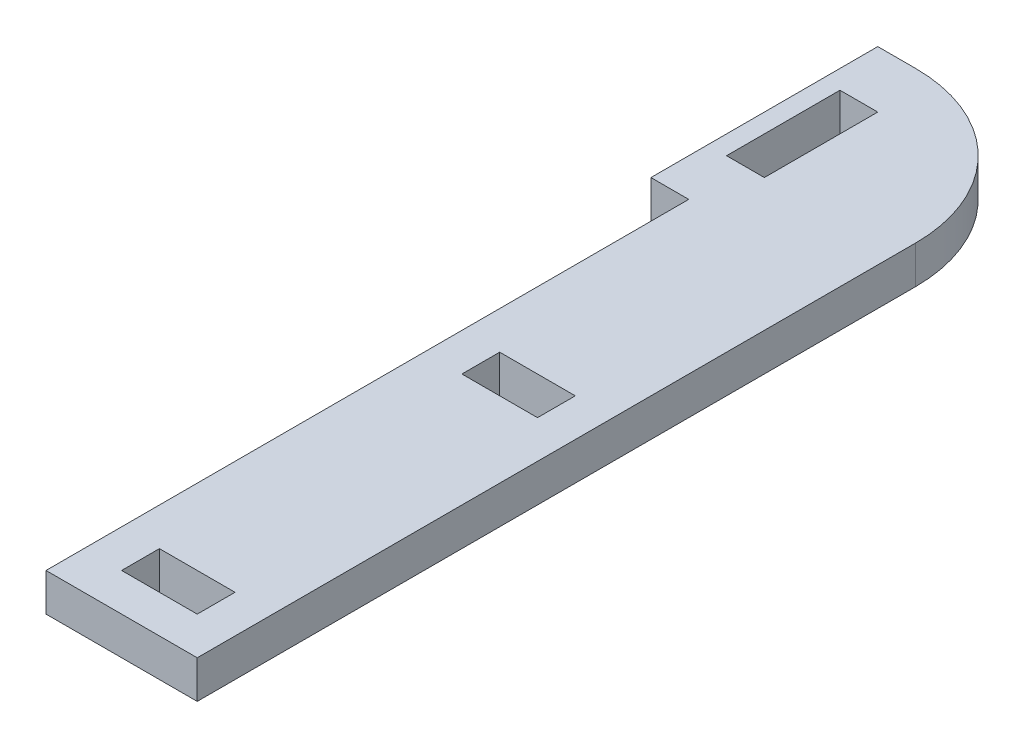
ISO-10303-21;
HEADER;
FILE_DESCRIPTION(('STEP AP214'),'2;1');
FILE_NAME('part.step','',(''),(''),'','','');
FILE_SCHEMA(('AUTOMOTIVE_DESIGN { 1 0 10303 214 1 1 1 1 }'));
ENDSEC;
DATA;
#1=APPLICATION_CONTEXT('core data for automotive mechanical design processes');
#2=APPLICATION_PROTOCOL_DEFINITION('international standard','automotive_design',2000,#1);
#3=PRODUCT_CONTEXT('',#1,'mechanical');
#4=PRODUCT('Part','Part','',(#3));
#5=PRODUCT_RELATED_PRODUCT_CATEGORY('part','',(#4));
#6=PRODUCT_DEFINITION_FORMATION('','',#4);
#7=PRODUCT_DEFINITION_CONTEXT('part definition',#1,'design');
#8=PRODUCT_DEFINITION('design','',#6,#7);
#9=PRODUCT_DEFINITION_SHAPE('','',#8);
#10=(LENGTH_UNIT() NAMED_UNIT(*) SI_UNIT(.MILLI.,.METRE.));
#11=(NAMED_UNIT(*) PLANE_ANGLE_UNIT() SI_UNIT($,.RADIAN.));
#12=(NAMED_UNIT(*) SI_UNIT($,.STERADIAN.) SOLID_ANGLE_UNIT());
#13=UNCERTAINTY_MEASURE_WITH_UNIT(LENGTH_MEASURE(1.E-05),#10,'distance_accuracy_value','');
#14=(GEOMETRIC_REPRESENTATION_CONTEXT(3) GLOBAL_UNCERTAINTY_ASSIGNED_CONTEXT((#13)) GLOBAL_UNIT_ASSIGNED_CONTEXT((#10,
#11,#12)) REPRESENTATION_CONTEXT('',''));
#15=CARTESIAN_POINT('',(0.,0.,0.));
#16=DIRECTION('',(0.,0.,1.));
#17=DIRECTION('',(1.,0.,0.));
#18=AXIS2_PLACEMENT_3D('',#15,#16,#17);
#19=CARTESIAN_POINT('',(-25.0645388891909,5.,-115.02721355112));
#20=DIRECTION('',(0.,1.,0.));
#21=DIRECTION('',(0.,0.,1.));
#22=AXIS2_PLACEMENT_3D('',#19,#20,#21);
#23=PLANE('',#22);
#24=DIRECTION('',(0.,0.,1.));
#25=VECTOR('',#24,1.);
#26=CARTESIAN_POINT('',(-25.0645388891909,5.,-20.0272135511204));
#27=LINE('',#26,#25);
#28=CARTESIAN_POINT('',(-25.0645388891909,5.,-105.02721355112));
#29=VERTEX_POINT('',#28);
#30=CARTESIAN_POINT('',(-25.0645388891909,5.,-20.0272135511204));
#31=VERTEX_POINT('',#30);
#32=EDGE_CURVE('E305',#29,#31,#27,.T.);
#33=ORIENTED_EDGE('',*,*,#32,.T.);
#34=DIRECTION('',(1.,0.,0.));
#35=VECTOR('',#34,1.);
#36=CARTESIAN_POINT('',(-25.0645388891909,5.,-20.0272135511204));
#37=LINE('',#36,#35);
#38=CARTESIAN_POINT('',(-5.06453888919092,5.,-20.0272135511204));
#39=VERTEX_POINT('',#38);
#40=EDGE_CURVE('E309',#31,#39,#37,.T.);
#41=ORIENTED_EDGE('',*,*,#40,.T.);
#42=DIRECTION('',(0.,0.,-1.));
#43=VECTOR('',#42,1.);
#44=CARTESIAN_POINT('',(-5.06453888919092,5.,-20.0272135511204));
#45=LINE('',#44,#43);
#46=CARTESIAN_POINT('',(-5.06453888919091,5.,-115.02721355112));
#47=VERTEX_POINT('',#46);
#48=EDGE_CURVE('E313',#39,#47,#45,.T.);
#49=ORIENTED_EDGE('',*,*,#48,.T.);
#50=CARTESIAN_POINT('',(-25.0645388891909,5.,-115.02721355112));
#51=DIRECTION('',(0.,1.,0.));
#52=DIRECTION('',(0.,0.,1.));
#53=AXIS2_PLACEMENT_3D('',#50,#51,#52);
#54=CIRCLE('',#53,20.);
#55=CARTESIAN_POINT('',(-25.0645388891909,5.,-135.02721355112));
#56=VERTEX_POINT('',#55);
#57=EDGE_CURVE('E316',#47,#56,#54,.T.);
#58=ORIENTED_EDGE('',*,*,#57,.T.);
#59=DIRECTION('',(-1.,0.,0.));
#60=VECTOR('',#59,1.);
#61=CARTESIAN_POINT('',(-30.0645388891909,5.,-135.02721355112));
#62=LINE('',#61,#60);
#63=CARTESIAN_POINT('',(-30.0645388891909,5.,-135.02721355112));
#64=VERTEX_POINT('',#63);
#65=EDGE_CURVE('E319',#56,#64,#62,.T.);
#66=ORIENTED_EDGE('',*,*,#65,.T.);
#67=DIRECTION('',(0.,0.,1.));
#68=VECTOR('',#67,1.);
#69=CARTESIAN_POINT('',(-30.0645388891909,5.,-105.02721355112));
#70=LINE('',#69,#68);
#71=CARTESIAN_POINT('',(-30.0645388891909,5.,-105.02721355112));
#72=VERTEX_POINT('',#71);
#73=EDGE_CURVE('E322',#64,#72,#70,.T.);
#74=ORIENTED_EDGE('',*,*,#73,.T.);
#75=DIRECTION('',(1.,0.,0.));
#76=VECTOR('',#75,1.);
#77=CARTESIAN_POINT('',(-30.0645388891909,5.,-105.02721355112));
#78=LINE('',#77,#76);
#79=EDGE_CURVE('E325',#72,#29,#78,.T.);
#80=ORIENTED_EDGE('',*,*,#79,.T.);
#81=EDGE_LOOP('',(#33,#41,#49,#58,#66,#74,#80));
#82=FACE_BOUND('',#81,.T.);
#83=DIRECTION('',(1.,0.,0.));
#84=VECTOR('',#83,1.);
#85=CARTESIAN_POINT('',(-20.0645388891909,5.,-25.0272135511204));
#86=LINE('',#85,#84);
#87=CARTESIAN_POINT('',(-20.0645388891909,5.,-25.0272135511204));
#88=VERTEX_POINT('',#87);
#89=CARTESIAN_POINT('',(-10.0645388891909,5.,-25.0272135511204));
#90=VERTEX_POINT('',#89);
#91=EDGE_CURVE('E265',#88,#90,#86,.T.);
#92=ORIENTED_EDGE('',*,*,#91,.F.);
#93=DIRECTION('',(0.,0.,1.));
#94=VECTOR('',#93,1.);
#95=CARTESIAN_POINT('',(-20.0645388891909,5.,-25.0272135511204));
#96=LINE('',#95,#94);
#97=CARTESIAN_POINT('',(-20.0645388891909,5.,-30.0272135511204));
#98=VERTEX_POINT('',#97);
#99=EDGE_CURVE('E262',#98,#88,#96,.T.);
#100=ORIENTED_EDGE('',*,*,#99,.F.);
#101=DIRECTION('',(-1.,0.,0.));
#102=VECTOR('',#101,1.);
#103=CARTESIAN_POINT('',(-20.0645388891909,5.,-30.0272135511204));
#104=LINE('',#103,#102);
#105=CARTESIAN_POINT('',(-10.0645388891909,5.,-30.0272135511204));
#106=VERTEX_POINT('',#105);
#107=EDGE_CURVE('E273',#106,#98,#104,.T.);
#108=ORIENTED_EDGE('',*,*,#107,.F.);
#109=DIRECTION('',(0.,0.,-1.));
#110=VECTOR('',#109,1.);
#111=CARTESIAN_POINT('',(-10.0645388891909,5.,-25.0272135511204));
#112=LINE('',#111,#110);
#113=EDGE_CURVE('E269',#90,#106,#112,.T.);
#114=ORIENTED_EDGE('',*,*,#113,.F.);
#115=EDGE_LOOP('',(#92,#100,#108,#114));
#116=FACE_BOUND('',#115,.T.);
#117=DIRECTION('',(1.,0.,0.));
#118=VECTOR('',#117,1.);
#119=CARTESIAN_POINT('',(-20.0645388891909,5.,-70.0272135511204));
#120=LINE('',#119,#118);
#121=CARTESIAN_POINT('',(-20.0645388891909,5.,-70.0272135511204));
#122=VERTEX_POINT('',#121);
#123=CARTESIAN_POINT('',(-10.0645388891909,5.,-70.0272135511204));
#124=VERTEX_POINT('',#123);
#125=EDGE_CURVE('E222',#122,#124,#120,.T.);
#126=ORIENTED_EDGE('',*,*,#125,.F.);
#127=DIRECTION('',(0.,0.,1.));
#128=VECTOR('',#127,1.);
#129=CARTESIAN_POINT('',(-20.0645388891909,5.,-70.0272135511204));
#130=LINE('',#129,#128);
#131=CARTESIAN_POINT('',(-20.0645388891909,5.,-75.0272135511204));
#132=VERTEX_POINT('',#131);
#133=EDGE_CURVE('E219',#132,#122,#130,.T.);
#134=ORIENTED_EDGE('',*,*,#133,.F.);
#135=DIRECTION('',(-1.,0.,0.));
#136=VECTOR('',#135,1.);
#137=CARTESIAN_POINT('',(-20.0645388891909,5.,-75.0272135511204));
#138=LINE('',#137,#136);
#139=CARTESIAN_POINT('',(-10.0645388891909,5.,-75.0272135511204));
#140=VERTEX_POINT('',#139);
#141=EDGE_CURVE('E230',#140,#132,#138,.T.);
#142=ORIENTED_EDGE('',*,*,#141,.F.);
#143=DIRECTION('',(0.,0.,-1.));
#144=VECTOR('',#143,1.);
#145=CARTESIAN_POINT('',(-10.0645388891909,5.,-70.0272135511204));
#146=LINE('',#145,#144);
#147=EDGE_CURVE('E226',#124,#140,#146,.T.);
#148=ORIENTED_EDGE('',*,*,#147,.F.);
#149=EDGE_LOOP('',(#126,#134,#142,#148));
#150=FACE_BOUND('',#149,.T.);
#151=DIRECTION('',(-1.,0.,0.));
#152=VECTOR('',#151,1.);
#153=CARTESIAN_POINT('',(-27.5645388891909,5.,-127.52721355112));
#154=LINE('',#153,#152);
#155=CARTESIAN_POINT('',(-22.5645388891909,5.,-127.52721355112));
#156=VERTEX_POINT('',#155);
#157=CARTESIAN_POINT('',(-27.5645388891909,5.,-127.52721355112));
#158=VERTEX_POINT('',#157);
#159=EDGE_CURVE('E180',#156,#158,#154,.T.);
#160=ORIENTED_EDGE('',*,*,#159,.F.);
#161=DIRECTION('',(0.,0.,-1.));
#162=VECTOR('',#161,1.);
#163=CARTESIAN_POINT('',(-22.5645388891909,5.,-112.52721355112));
#164=LINE('',#163,#162);
#165=CARTESIAN_POINT('',(-22.5645388891909,5.,-112.52721355112));
#166=VERTEX_POINT('',#165);
#167=EDGE_CURVE('E171',#166,#156,#164,.T.);
#168=ORIENTED_EDGE('',*,*,#167,.F.);
#169=DIRECTION('',(1.,0.,0.));
#170=VECTOR('',#169,1.);
#171=CARTESIAN_POINT('',(-27.5645388891909,5.,-112.52721355112));
#172=LINE('',#171,#170);
#173=CARTESIAN_POINT('',(-27.5645388891909,5.,-112.52721355112));
#174=VERTEX_POINT('',#173);
#175=EDGE_CURVE('E197',#174,#166,#172,.T.);
#176=ORIENTED_EDGE('',*,*,#175,.F.);
#177=DIRECTION('',(0.,0.,1.));
#178=VECTOR('',#177,1.);
#179=CARTESIAN_POINT('',(-27.5645388891909,5.,-112.52721355112));
#180=LINE('',#179,#178);
#181=EDGE_CURVE('E193',#158,#174,#180,.T.);
#182=ORIENTED_EDGE('',*,*,#181,.F.);
#183=EDGE_LOOP('',(#160,#168,#176,#182));
#184=FACE_BOUND('',#183,.T.);
#185=ADVANCED_FACE('F39',(#82,#116,#150,#184),#23,.T.);
#186=CARTESIAN_POINT('',(-25.0645388891909,0.,-115.02721355112));
#187=DIRECTION('',(0.,1.,0.));
#188=DIRECTION('',(0.,0.,1.));
#189=AXIS2_PLACEMENT_3D('',#186,#187,#188);
#190=PLANE('',#189);
#191=DIRECTION('',(0.,0.,1.));
#192=VECTOR('',#191,1.);
#193=CARTESIAN_POINT('',(-20.0645388891909,0.,-70.0272135511204));
#194=LINE('',#193,#192);
#195=CARTESIAN_POINT('',(-20.0645388891909,0.,-75.0272135511204));
#196=VERTEX_POINT('',#195);
#197=CARTESIAN_POINT('',(-20.0645388891909,0.,-70.0272135511204));
#198=VERTEX_POINT('',#197);
#199=EDGE_CURVE('E189',#196,#198,#194,.T.);
#200=ORIENTED_EDGE('',*,*,#199,.T.);
#201=DIRECTION('',(1.,0.,0.));
#202=VECTOR('',#201,1.);
#203=CARTESIAN_POINT('',(-20.0645388891909,0.,-70.0272135511204));
#204=LINE('',#203,#202);
#205=CARTESIAN_POINT('',(-10.0645388891909,0.,-70.0272135511204));
#206=VERTEX_POINT('',#205);
#207=EDGE_CURVE('E237',#198,#206,#204,.T.);
#208=ORIENTED_EDGE('',*,*,#207,.T.);
#209=DIRECTION('',(0.,0.,-1.));
#210=VECTOR('',#209,1.);
#211=CARTESIAN_POINT('',(-10.0645388891909,0.,-70.0272135511204));
#212=LINE('',#211,#210);
#213=CARTESIAN_POINT('',(-10.0645388891909,0.,-75.0272135511204));
#214=VERTEX_POINT('',#213);
#215=EDGE_CURVE('E241',#206,#214,#212,.T.);
#216=ORIENTED_EDGE('',*,*,#215,.T.);
#217=DIRECTION('',(-1.,0.,0.));
#218=VECTOR('',#217,1.);
#219=CARTESIAN_POINT('',(-20.0645388891909,0.,-75.0272135511204));
#220=LINE('',#219,#218);
#221=EDGE_CURVE('E223',#214,#196,#220,.T.);
#222=ORIENTED_EDGE('',*,*,#221,.T.);
#223=EDGE_LOOP('',(#200,#208,#216,#222));
#224=FACE_BOUND('',#223,.T.);
#225=DIRECTION('',(1.,0.,0.));
#226=VECTOR('',#225,1.);
#227=CARTESIAN_POINT('',(-25.0645388891909,0.,-20.0272135511204));
#228=LINE('',#227,#226);
#229=CARTESIAN_POINT('',(-25.0645388891909,0.,-20.0272135511204));
#230=VERTEX_POINT('',#229);
#231=CARTESIAN_POINT('',(-5.06453888919092,0.,-20.0272135511204));
#232=VERTEX_POINT('',#231);
#233=EDGE_CURVE('E304',#230,#232,#228,.T.);
#234=ORIENTED_EDGE('',*,*,#233,.F.);
#235=DIRECTION('',(0.,0.,1.));
#236=VECTOR('',#235,1.);
#237=CARTESIAN_POINT('',(-25.0645388891909,0.,-80.0272135511204));
#238=LINE('',#237,#236);
#239=CARTESIAN_POINT('',(-25.0645388891909,0.,-105.02721355112));
#240=VERTEX_POINT('',#239);
#241=EDGE_CURVE('E310',#240,#230,#238,.T.);
#242=ORIENTED_EDGE('',*,*,#241,.F.);
#243=DIRECTION('',(1.,0.,0.));
#244=VECTOR('',#243,1.);
#245=CARTESIAN_POINT('',(-30.0645388891909,0.,-105.02721355112));
#246=LINE('',#245,#244);
#247=CARTESIAN_POINT('',(-30.0645388891909,0.,-105.02721355112));
#248=VERTEX_POINT('',#247);
#249=EDGE_CURVE('E345',#248,#240,#246,.T.);
#250=ORIENTED_EDGE('',*,*,#249,.F.);
#251=DIRECTION('',(0.,0.,1.));
#252=VECTOR('',#251,1.);
#253=CARTESIAN_POINT('',(-30.0645388891909,0.,-105.02721355112));
#254=LINE('',#253,#252);
#255=CARTESIAN_POINT('',(-30.0645388891909,0.,-135.02721355112));
#256=VERTEX_POINT('',#255);
#257=EDGE_CURVE('E342',#256,#248,#254,.T.);
#258=ORIENTED_EDGE('',*,*,#257,.F.);
#259=DIRECTION('',(-1.,0.,0.));
#260=VECTOR('',#259,1.);
#261=CARTESIAN_POINT('',(-30.0645388891909,0.,-135.02721355112));
#262=LINE('',#261,#260);
#263=CARTESIAN_POINT('',(-25.0645388891909,0.,-135.02721355112));
#264=VERTEX_POINT('',#263);
#265=EDGE_CURVE('E339',#264,#256,#262,.T.);
#266=ORIENTED_EDGE('',*,*,#265,.F.);
#267=CARTESIAN_POINT('',(-25.0645388891909,0.,-115.02721355112));
#268=DIRECTION('',(0.,1.,0.));
#269=DIRECTION('',(0.,0.,1.));
#270=AXIS2_PLACEMENT_3D('',#267,#268,#269);
#271=CIRCLE('',#270,20.);
#272=CARTESIAN_POINT('',(-5.06453888919091,0.,-115.02721355112));
#273=VERTEX_POINT('',#272);
#274=EDGE_CURVE('E336',#273,#264,#271,.T.);
#275=ORIENTED_EDGE('',*,*,#274,.F.);
#276=DIRECTION('',(0.,0.,-1.));
#277=VECTOR('',#276,1.);
#278=CARTESIAN_POINT('',(-5.06453888919092,0.,-80.0272135511204));
#279=LINE('',#278,#277);
#280=EDGE_CURVE('E333',#232,#273,#279,.T.);
#281=ORIENTED_EDGE('',*,*,#280,.F.);
#282=EDGE_LOOP('',(#234,#242,#250,#258,#266,#275,#281));
#283=FACE_BOUND('',#282,.T.);
#284=DIRECTION('',(0.,0.,1.));
#285=VECTOR('',#284,1.);
#286=CARTESIAN_POINT('',(-20.0645388891909,0.,-25.0272135511204));
#287=LINE('',#286,#285);
#288=CARTESIAN_POINT('',(-20.0645388891909,0.,-30.0272135511204));
#289=VERTEX_POINT('',#288);
#290=CARTESIAN_POINT('',(-20.0645388891909,0.,-25.0272135511204));
#291=VERTEX_POINT('',#290);
#292=EDGE_CURVE('E261',#289,#291,#287,.T.);
#293=ORIENTED_EDGE('',*,*,#292,.T.);
#294=DIRECTION('',(1.,0.,0.));
#295=VECTOR('',#294,1.);
#296=CARTESIAN_POINT('',(-20.0645388891909,0.,-25.0272135511204));
#297=LINE('',#296,#295);
#298=CARTESIAN_POINT('',(-10.0645388891909,0.,-25.0272135511204));
#299=VERTEX_POINT('',#298);
#300=EDGE_CURVE('E280',#291,#299,#297,.T.);
#301=ORIENTED_EDGE('',*,*,#300,.T.);
#302=DIRECTION('',(0.,0.,-1.));
#303=VECTOR('',#302,1.);
#304=CARTESIAN_POINT('',(-10.0645388891909,0.,-25.0272135511204));
#305=LINE('',#304,#303);
#306=CARTESIAN_POINT('',(-10.0645388891909,0.,-30.0272135511204));
#307=VERTEX_POINT('',#306);
#308=EDGE_CURVE('E284',#299,#307,#305,.T.);
#309=ORIENTED_EDGE('',*,*,#308,.T.);
#310=DIRECTION('',(-1.,0.,0.));
#311=VECTOR('',#310,1.);
#312=CARTESIAN_POINT('',(-20.0645388891909,0.,-30.0272135511204));
#313=LINE('',#312,#311);
#314=EDGE_CURVE('E266',#307,#289,#313,.T.);
#315=ORIENTED_EDGE('',*,*,#314,.T.);
#316=EDGE_LOOP('',(#293,#301,#309,#315));
#317=FACE_BOUND('',#316,.T.);
#318=DIRECTION('',(0.,0.,-1.));
#319=VECTOR('',#318,1.);
#320=CARTESIAN_POINT('',(-22.5645388891909,0.,-112.52721355112));
#321=LINE('',#320,#319);
#322=CARTESIAN_POINT('',(-22.5645388891909,0.,-112.52721355112));
#323=VERTEX_POINT('',#322);
#324=CARTESIAN_POINT('',(-22.5645388891909,0.,-127.52721355112));
#325=VERTEX_POINT('',#324);
#326=EDGE_CURVE('E63',#323,#325,#321,.T.);
#327=ORIENTED_EDGE('',*,*,#326,.T.);
#328=DIRECTION('',(-1.,0.,0.));
#329=VECTOR('',#328,1.);
#330=CARTESIAN_POINT('',(-27.5645388891909,0.,-127.52721355112));
#331=LINE('',#330,#329);
#332=CARTESIAN_POINT('',(-27.5645388891909,0.,-127.52721355112));
#333=VERTEX_POINT('',#332);
#334=EDGE_CURVE('E187',#325,#333,#331,.T.);
#335=ORIENTED_EDGE('',*,*,#334,.T.);
#336=DIRECTION('',(0.,0.,1.));
#337=VECTOR('',#336,1.);
#338=CARTESIAN_POINT('',(-27.5645388891909,0.,-112.52721355112));
#339=LINE('',#338,#337);
#340=CARTESIAN_POINT('',(-27.5645388891909,0.,-112.52721355112));
#341=VERTEX_POINT('',#340);
#342=EDGE_CURVE('E206',#333,#341,#339,.T.);
#343=ORIENTED_EDGE('',*,*,#342,.T.);
#344=DIRECTION('',(1.,0.,0.));
#345=VECTOR('',#344,1.);
#346=CARTESIAN_POINT('',(-27.5645388891909,0.,-112.52721355112));
#347=LINE('',#346,#345);
#348=EDGE_CURVE('E181',#341,#323,#347,.T.);
#349=ORIENTED_EDGE('',*,*,#348,.T.);
#350=EDGE_LOOP('',(#327,#335,#343,#349));
#351=FACE_BOUND('',#350,.T.);
#352=ADVANCED_FACE('F380',(#224,#283,#317,#351),#190,.F.);
#353=CARTESIAN_POINT('',(-25.0645388891909,5.,-20.0272135511204));
#354=DIRECTION('',(0.,0.,-1.));
#355=DIRECTION('',(-1.,0.,0.));
#356=AXIS2_PLACEMENT_3D('',#353,#354,#355);
#357=PLANE('',#356);
#358=ORIENTED_EDGE('',*,*,#233,.T.);
#359=DIRECTION('',(0.,-1.,0.));
#360=VECTOR('',#359,1.);
#361=CARTESIAN_POINT('',(-5.06453888919092,5.,-20.0272135511204));
#362=LINE('',#361,#360);
#363=EDGE_CURVE('E48',#39,#232,#362,.T.);
#364=ORIENTED_EDGE('',*,*,#363,.F.);
#365=ORIENTED_EDGE('',*,*,#40,.F.);
#366=DIRECTION('',(0.,-1.,0.));
#367=VECTOR('',#366,1.);
#368=CARTESIAN_POINT('',(-25.0645388891909,5.,-20.0272135511204));
#369=LINE('',#368,#367);
#370=EDGE_CURVE('E11',#31,#230,#369,.T.);
#371=ORIENTED_EDGE('',*,*,#370,.T.);
#372=EDGE_LOOP('',(#358,#364,#365,#371));
#373=FACE_BOUND('',#372,.T.);
#374=ADVANCED_FACE('F41',(#373),#357,.F.);
#375=CARTESIAN_POINT('',(-5.06453888919092,5.,-80.0272135511204));
#376=DIRECTION('',(-1.,0.,0.));
#377=DIRECTION('',(0.,0.,1.));
#378=AXIS2_PLACEMENT_3D('',#375,#376,#377);
#379=PLANE('',#378);
#380=ORIENTED_EDGE('',*,*,#280,.T.);
#381=DIRECTION('',(0.,-1.,0.));
#382=VECTOR('',#381,1.);
#383=CARTESIAN_POINT('',(-5.06453888919091,5.,-115.02721355112));
#384=LINE('',#383,#382);
#385=EDGE_CURVE('E365',#47,#273,#384,.T.);
#386=ORIENTED_EDGE('',*,*,#385,.F.);
#387=ORIENTED_EDGE('',*,*,#48,.F.);
#388=ORIENTED_EDGE('',*,*,#363,.T.);
#389=EDGE_LOOP('',(#380,#386,#387,#388));
#390=FACE_BOUND('',#389,.T.);
#391=ADVANCED_FACE('F373',(#390),#379,.F.);
#392=CARTESIAN_POINT('',(-25.0645388891909,5.,-115.02721355112));
#393=DIRECTION('',(0.,-1.,0.));
#394=DIRECTION('',(0.,0.,-1.));
#395=AXIS2_PLACEMENT_3D('',#392,#393,#394);
#396=CYLINDRICAL_SURFACE('',#395,20.);
#397=ORIENTED_EDGE('',*,*,#274,.T.);
#398=DIRECTION('',(0.,-1.,0.));
#399=VECTOR('',#398,1.);
#400=CARTESIAN_POINT('',(-25.0645388891909,5.,-135.02721355112));
#401=LINE('',#400,#399);
#402=EDGE_CURVE('E361',#56,#264,#401,.T.);
#403=ORIENTED_EDGE('',*,*,#402,.F.);
#404=ORIENTED_EDGE('',*,*,#57,.F.);
#405=ORIENTED_EDGE('',*,*,#385,.T.);
#406=EDGE_LOOP('',(#397,#403,#404,#405));
#407=FACE_BOUND('',#406,.T.);
#408=ADVANCED_FACE('F388',(#407),#396,.T.);
#409=CARTESIAN_POINT('',(-30.0645388891909,5.,-135.02721355112));
#410=DIRECTION('',(0.,0.,1.));
#411=DIRECTION('',(1.,0.,0.));
#412=AXIS2_PLACEMENT_3D('',#409,#410,#411);
#413=PLANE('',#412);
#414=ORIENTED_EDGE('',*,*,#265,.T.);
#415=DIRECTION('',(0.,-1.,0.));
#416=VECTOR('',#415,1.);
#417=CARTESIAN_POINT('',(-30.0645388891909,5.,-135.02721355112));
#418=LINE('',#417,#416);
#419=EDGE_CURVE('E357',#64,#256,#418,.T.);
#420=ORIENTED_EDGE('',*,*,#419,.F.);
#421=ORIENTED_EDGE('',*,*,#65,.F.);
#422=ORIENTED_EDGE('',*,*,#402,.T.);
#423=EDGE_LOOP('',(#414,#420,#421,#422));
#424=FACE_BOUND('',#423,.T.);
#425=ADVANCED_FACE('F392',(#424),#413,.F.);
#426=CARTESIAN_POINT('',(-30.0645388891909,5.,-105.02721355112));
#427=DIRECTION('',(1.,0.,0.));
#428=DIRECTION('',(0.,0.,-1.));
#429=AXIS2_PLACEMENT_3D('',#426,#427,#428);
#430=PLANE('',#429);
#431=ORIENTED_EDGE('',*,*,#257,.T.);
#432=DIRECTION('',(0.,-1.,0.));
#433=VECTOR('',#432,1.);
#434=CARTESIAN_POINT('',(-30.0645388891909,5.,-105.02721355112));
#435=LINE('',#434,#433);
#436=EDGE_CURVE('E353',#72,#248,#435,.T.);
#437=ORIENTED_EDGE('',*,*,#436,.F.);
#438=ORIENTED_EDGE('',*,*,#73,.F.);
#439=ORIENTED_EDGE('',*,*,#419,.T.);
#440=EDGE_LOOP('',(#431,#437,#438,#439));
#441=FACE_BOUND('',#440,.T.);
#442=ADVANCED_FACE('F405',(#441),#430,.F.);
#443=CARTESIAN_POINT('',(-30.0645388891909,5.,-105.02721355112));
#444=DIRECTION('',(0.,0.,-1.));
#445=DIRECTION('',(-1.,0.,0.));
#446=AXIS2_PLACEMENT_3D('',#443,#444,#445);
#447=PLANE('',#446);
#448=ORIENTED_EDGE('',*,*,#249,.T.);
#449=DIRECTION('',(0.,-1.,0.));
#450=VECTOR('',#449,1.);
#451=CARTESIAN_POINT('',(-25.0645388891909,5.,-105.02721355112));
#452=LINE('',#451,#450);
#453=EDGE_CURVE('E329',#29,#240,#452,.T.);
#454=ORIENTED_EDGE('',*,*,#453,.F.);
#455=ORIENTED_EDGE('',*,*,#79,.F.);
#456=ORIENTED_EDGE('',*,*,#436,.T.);
#457=EDGE_LOOP('',(#448,#454,#455,#456));
#458=FACE_BOUND('',#457,.T.);
#459=ADVANCED_FACE('F403',(#458),#447,.F.);
#460=CARTESIAN_POINT('',(-25.0645388891909,5.,-80.0272135511204));
#461=DIRECTION('',(1.,0.,0.));
#462=DIRECTION('',(0.,0.,-1.));
#463=AXIS2_PLACEMENT_3D('',#460,#461,#462);
#464=PLANE('',#463);
#465=ORIENTED_EDGE('',*,*,#241,.T.);
#466=ORIENTED_EDGE('',*,*,#370,.F.);
#467=ORIENTED_EDGE('',*,*,#32,.F.);
#468=ORIENTED_EDGE('',*,*,#453,.T.);
#469=EDGE_LOOP('',(#465,#466,#467,#468));
#470=FACE_BOUND('',#469,.T.);
#471=ADVANCED_FACE('F401',(#470),#464,.F.);
#472=CARTESIAN_POINT('',(-20.0645388891909,5.,-25.0272135511204));
#473=DIRECTION('',(1.,0.,0.));
#474=DIRECTION('',(0.,0.,-1.));
#475=AXIS2_PLACEMENT_3D('',#472,#473,#474);
#476=PLANE('',#475);
#477=ORIENTED_EDGE('',*,*,#292,.F.);
#478=DIRECTION('',(0.,-1.,0.));
#479=VECTOR('',#478,1.);
#480=CARTESIAN_POINT('',(-20.0645388891909,5.,-30.0272135511204));
#481=LINE('',#480,#479);
#482=EDGE_CURVE('E276',#98,#289,#481,.T.);
#483=ORIENTED_EDGE('',*,*,#482,.F.);
#484=ORIENTED_EDGE('',*,*,#99,.T.);
#485=DIRECTION('',(0.,-1.,0.));
#486=VECTOR('',#485,1.);
#487=CARTESIAN_POINT('',(-20.0645388891909,5.,-25.0272135511204));
#488=LINE('',#487,#486);
#489=EDGE_CURVE('E300',#88,#291,#488,.T.);
#490=ORIENTED_EDGE('',*,*,#489,.T.);
#491=EDGE_LOOP('',(#477,#483,#484,#490));
#492=FACE_BOUND('',#491,.T.);
#493=ADVANCED_FACE('F422',(#492),#476,.T.);
#494=CARTESIAN_POINT('',(-20.0645388891909,5.,-25.0272135511204));
#495=DIRECTION('',(0.,0.,-1.));
#496=DIRECTION('',(-1.,0.,0.));
#497=AXIS2_PLACEMENT_3D('',#494,#495,#496);
#498=PLANE('',#497);
#499=ORIENTED_EDGE('',*,*,#300,.F.);
#500=ORIENTED_EDGE('',*,*,#489,.F.);
#501=ORIENTED_EDGE('',*,*,#91,.T.);
#502=DIRECTION('',(0.,-1.,0.));
#503=VECTOR('',#502,1.);
#504=CARTESIAN_POINT('',(-10.0645388891909,5.,-25.0272135511204));
#505=LINE('',#504,#503);
#506=EDGE_CURVE('E297',#90,#299,#505,.T.);
#507=ORIENTED_EDGE('',*,*,#506,.T.);
#508=EDGE_LOOP('',(#499,#500,#501,#507));
#509=FACE_BOUND('',#508,.T.);
#510=ADVANCED_FACE('F429',(#509),#498,.T.);
#511=CARTESIAN_POINT('',(-10.0645388891909,5.,-25.0272135511204));
#512=DIRECTION('',(-1.,0.,0.));
#513=DIRECTION('',(0.,0.,1.));
#514=AXIS2_PLACEMENT_3D('',#511,#512,#513);
#515=PLANE('',#514);
#516=ORIENTED_EDGE('',*,*,#308,.F.);
#517=ORIENTED_EDGE('',*,*,#506,.F.);
#518=ORIENTED_EDGE('',*,*,#113,.T.);
#519=DIRECTION('',(0.,-1.,0.));
#520=VECTOR('',#519,1.);
#521=CARTESIAN_POINT('',(-10.0645388891909,5.,-30.0272135511204));
#522=LINE('',#521,#520);
#523=EDGE_CURVE('E294',#106,#307,#522,.T.);
#524=ORIENTED_EDGE('',*,*,#523,.T.);
#525=EDGE_LOOP('',(#516,#517,#518,#524));
#526=FACE_BOUND('',#525,.T.);
#527=ADVANCED_FACE('F434',(#526),#515,.T.);
#528=CARTESIAN_POINT('',(-20.0645388891909,5.,-30.0272135511204));
#529=DIRECTION('',(0.,0.,1.));
#530=DIRECTION('',(1.,0.,0.));
#531=AXIS2_PLACEMENT_3D('',#528,#529,#530);
#532=PLANE('',#531);
#533=ORIENTED_EDGE('',*,*,#314,.F.);
#534=ORIENTED_EDGE('',*,*,#523,.F.);
#535=ORIENTED_EDGE('',*,*,#107,.T.);
#536=ORIENTED_EDGE('',*,*,#482,.T.);
#537=EDGE_LOOP('',(#533,#534,#535,#536));
#538=FACE_BOUND('',#537,.T.);
#539=ADVANCED_FACE('F441',(#538),#532,.T.);
#540=CARTESIAN_POINT('',(-20.0645388891909,5.,-70.0272135511204));
#541=DIRECTION('',(1.,0.,0.));
#542=DIRECTION('',(0.,0.,-1.));
#543=AXIS2_PLACEMENT_3D('',#540,#541,#542);
#544=PLANE('',#543);
#545=ORIENTED_EDGE('',*,*,#199,.F.);
#546=DIRECTION('',(0.,-1.,0.));
#547=VECTOR('',#546,1.);
#548=CARTESIAN_POINT('',(-20.0645388891909,5.,-75.0272135511204));
#549=LINE('',#548,#547);
#550=EDGE_CURVE('E233',#132,#196,#549,.T.);
#551=ORIENTED_EDGE('',*,*,#550,.F.);
#552=ORIENTED_EDGE('',*,*,#133,.T.);
#553=DIRECTION('',(0.,-1.,0.));
#554=VECTOR('',#553,1.);
#555=CARTESIAN_POINT('',(-20.0645388891909,5.,-70.0272135511204));
#556=LINE('',#555,#554);
#557=EDGE_CURVE('E257',#122,#198,#556,.T.);
#558=ORIENTED_EDGE('',*,*,#557,.T.);
#559=EDGE_LOOP('',(#545,#551,#552,#558));
#560=FACE_BOUND('',#559,.T.);
#561=ADVANCED_FACE('F463',(#560),#544,.T.);
#562=CARTESIAN_POINT('',(-20.0645388891909,5.,-70.0272135511204));
#563=DIRECTION('',(0.,0.,-1.));
#564=DIRECTION('',(-1.,0.,0.));
#565=AXIS2_PLACEMENT_3D('',#562,#563,#564);
#566=PLANE('',#565);
#567=ORIENTED_EDGE('',*,*,#207,.F.);
#568=ORIENTED_EDGE('',*,*,#557,.F.);
#569=ORIENTED_EDGE('',*,*,#125,.T.);
#570=DIRECTION('',(0.,-1.,0.));
#571=VECTOR('',#570,1.);
#572=CARTESIAN_POINT('',(-10.0645388891909,5.,-70.0272135511204));
#573=LINE('',#572,#571);
#574=EDGE_CURVE('E254',#124,#206,#573,.T.);
#575=ORIENTED_EDGE('',*,*,#574,.T.);
#576=EDGE_LOOP('',(#567,#568,#569,#575));
#577=FACE_BOUND('',#576,.T.);
#578=ADVANCED_FACE('F457',(#577),#566,.T.);
#579=CARTESIAN_POINT('',(-10.0645388891909,5.,-70.0272135511204));
#580=DIRECTION('',(-1.,0.,0.));
#581=DIRECTION('',(0.,0.,1.));
#582=AXIS2_PLACEMENT_3D('',#579,#580,#581);
#583=PLANE('',#582);
#584=ORIENTED_EDGE('',*,*,#215,.F.);
#585=ORIENTED_EDGE('',*,*,#574,.F.);
#586=ORIENTED_EDGE('',*,*,#147,.T.);
#587=DIRECTION('',(0.,-1.,0.));
#588=VECTOR('',#587,1.);
#589=CARTESIAN_POINT('',(-10.0645388891909,5.,-75.0272135511204));
#590=LINE('',#589,#588);
#591=EDGE_CURVE('E251',#140,#214,#590,.T.);
#592=ORIENTED_EDGE('',*,*,#591,.T.);
#593=EDGE_LOOP('',(#584,#585,#586,#592));
#594=FACE_BOUND('',#593,.T.);
#595=ADVANCED_FACE('F460',(#594),#583,.T.);
#596=CARTESIAN_POINT('',(-20.0645388891909,5.,-75.0272135511204));
#597=DIRECTION('',(0.,0.,1.));
#598=DIRECTION('',(1.,0.,0.));
#599=AXIS2_PLACEMENT_3D('',#596,#597,#598);
#600=PLANE('',#599);
#601=ORIENTED_EDGE('',*,*,#221,.F.);
#602=ORIENTED_EDGE('',*,*,#591,.F.);
#603=ORIENTED_EDGE('',*,*,#141,.T.);
#604=ORIENTED_EDGE('',*,*,#550,.T.);
#605=EDGE_LOOP('',(#601,#602,#603,#604));
#606=FACE_BOUND('',#605,.T.);
#607=ADVANCED_FACE('F466',(#606),#600,.T.);
#608=CARTESIAN_POINT('',(-22.5645388891909,5.,-112.52721355112));
#609=DIRECTION('',(-1.,0.,0.));
#610=DIRECTION('',(0.,0.,1.));
#611=AXIS2_PLACEMENT_3D('',#608,#609,#610);
#612=PLANE('',#611);
#613=ORIENTED_EDGE('',*,*,#326,.F.);
#614=DIRECTION('',(0.,-1.,0.));
#615=VECTOR('',#614,1.);
#616=CARTESIAN_POINT('',(-22.5645388891909,5.,-112.52721355112));
#617=LINE('',#616,#615);
#618=EDGE_CURVE('E175',#166,#323,#617,.T.);
#619=ORIENTED_EDGE('',*,*,#618,.F.);
#620=ORIENTED_EDGE('',*,*,#167,.T.);
#621=DIRECTION('',(0.,-1.,0.));
#622=VECTOR('',#621,1.);
#623=CARTESIAN_POINT('',(-22.5645388891909,5.,-127.52721355112));
#624=LINE('',#623,#622);
#625=EDGE_CURVE('E174',#156,#325,#624,.T.);
#626=ORIENTED_EDGE('',*,*,#625,.T.);
#627=EDGE_LOOP('',(#613,#619,#620,#626));
#628=FACE_BOUND('',#627,.T.);
#629=ADVANCED_FACE('F173',(#628),#612,.T.);
#630=CARTESIAN_POINT('',(-27.5645388891909,5.,-127.52721355112));
#631=DIRECTION('',(0.,0.,1.));
#632=DIRECTION('',(1.,0.,0.));
#633=AXIS2_PLACEMENT_3D('',#630,#631,#632);
#634=PLANE('',#633);
#635=ORIENTED_EDGE('',*,*,#334,.F.);
#636=ORIENTED_EDGE('',*,*,#625,.F.);
#637=ORIENTED_EDGE('',*,*,#159,.T.);
#638=DIRECTION('',(0.,-1.,0.));
#639=VECTOR('',#638,1.);
#640=CARTESIAN_POINT('',(-27.5645388891909,5.,-127.52721355112));
#641=LINE('',#640,#639);
#642=EDGE_CURVE('E190',#158,#333,#641,.T.);
#643=ORIENTED_EDGE('',*,*,#642,.T.);
#644=EDGE_LOOP('',(#635,#636,#637,#643));
#645=FACE_BOUND('',#644,.T.);
#646=ADVANCED_FACE('F184',(#645),#634,.T.);
#647=CARTESIAN_POINT('',(-27.5645388891909,5.,-112.52721355112));
#648=DIRECTION('',(1.,0.,0.));
#649=DIRECTION('',(0.,0.,-1.));
#650=AXIS2_PLACEMENT_3D('',#647,#648,#649);
#651=PLANE('',#650);
#652=ORIENTED_EDGE('',*,*,#342,.F.);
#653=ORIENTED_EDGE('',*,*,#642,.F.);
#654=ORIENTED_EDGE('',*,*,#181,.T.);
#655=DIRECTION('',(0.,-1.,0.));
#656=VECTOR('',#655,1.);
#657=CARTESIAN_POINT('',(-27.5645388891909,5.,-112.52721355112));
#658=LINE('',#657,#656);
#659=EDGE_CURVE('E55',#174,#341,#658,.T.);
#660=ORIENTED_EDGE('',*,*,#659,.T.);
#661=EDGE_LOOP('',(#652,#653,#654,#660));
#662=FACE_BOUND('',#661,.T.);
#663=ADVANCED_FACE('F523',(#662),#651,.T.);
#664=CARTESIAN_POINT('',(-27.5645388891909,5.,-112.52721355112));
#665=DIRECTION('',(0.,0.,-1.));
#666=DIRECTION('',(-1.,0.,0.));
#667=AXIS2_PLACEMENT_3D('',#664,#665,#666);
#668=PLANE('',#667);
#669=ORIENTED_EDGE('',*,*,#348,.F.);
#670=ORIENTED_EDGE('',*,*,#659,.F.);
#671=ORIENTED_EDGE('',*,*,#175,.T.);
#672=ORIENTED_EDGE('',*,*,#618,.T.);
#673=EDGE_LOOP('',(#669,#670,#671,#672));
#674=FACE_BOUND('',#673,.T.);
#675=ADVANCED_FACE('F531',(#674),#668,.T.);
#676=CLOSED_SHELL('',(#185,#352,#374,#391,#408,#425,#442,#459,#471,#493,#510,#527,#539,#561,
#578,#595,#607,#629,#646,#663,#675));
#677=MANIFOLD_SOLID_BREP('B2',#676);
#678=ADVANCED_BREP_SHAPE_REPRESENTATION('',(#18,#677),#14);
#679=SHAPE_DEFINITION_REPRESENTATION(#9,#678);
ENDSEC;
END-ISO-10303-21;
